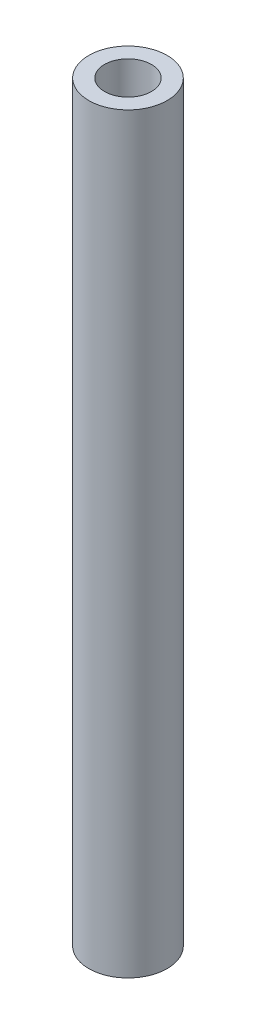
ISO-10303-21;
HEADER;
FILE_DESCRIPTION(('STEP AP214'),'2;1');
FILE_NAME('part.step','',(''),(''),'','','');
FILE_SCHEMA(('AUTOMOTIVE_DESIGN { 1 0 10303 214 1 1 1 1 }'));
ENDSEC;
DATA;
#1=APPLICATION_CONTEXT('core data for automotive mechanical design processes');
#2=APPLICATION_PROTOCOL_DEFINITION('international standard','automotive_design',2000,#1);
#3=PRODUCT_CONTEXT('',#1,'mechanical');
#4=PRODUCT('Part','Part','',(#3));
#5=PRODUCT_RELATED_PRODUCT_CATEGORY('part','',(#4));
#6=PRODUCT_DEFINITION_FORMATION('','',#4);
#7=PRODUCT_DEFINITION_CONTEXT('part definition',#1,'design');
#8=PRODUCT_DEFINITION('design','',#6,#7);
#9=PRODUCT_DEFINITION_SHAPE('','',#8);
#10=(LENGTH_UNIT() NAMED_UNIT(*) SI_UNIT(.MILLI.,.METRE.));
#11=(NAMED_UNIT(*) PLANE_ANGLE_UNIT() SI_UNIT($,.RADIAN.));
#12=(NAMED_UNIT(*) SI_UNIT($,.STERADIAN.) SOLID_ANGLE_UNIT());
#13=UNCERTAINTY_MEASURE_WITH_UNIT(LENGTH_MEASURE(1.E-05),#10,'distance_accuracy_value','');
#14=(GEOMETRIC_REPRESENTATION_CONTEXT(3) GLOBAL_UNCERTAINTY_ASSIGNED_CONTEXT((#13)) GLOBAL_UNIT_ASSIGNED_CONTEXT((#10,
#11,#12)) REPRESENTATION_CONTEXT('',''));
#15=CARTESIAN_POINT('',(0.,0.,0.));
#16=DIRECTION('',(0.,0.,1.));
#17=DIRECTION('',(1.,0.,0.));
#18=AXIS2_PLACEMENT_3D('',#15,#16,#17);
#19=CARTESIAN_POINT('',(0.,48.,0.));
#20=DIRECTION('',(0.,1.,0.));
#21=DIRECTION('',(0.,0.,1.));
#22=AXIS2_PLACEMENT_3D('',#19,#20,#21);
#23=PLANE('',#22);
#24=CARTESIAN_POINT('',(0.,48.,0.));
#25=DIRECTION('',(0.,1.,0.));
#26=DIRECTION('',(0.,0.,1.));
#27=AXIS2_PLACEMENT_3D('',#24,#25,#26);
#28=CIRCLE('',#27,2.5);
#29=CARTESIAN_POINT('',(0.,48.,2.5));
#30=VERTEX_POINT('',#29);
#31=EDGE_CURVE('E10',#30,#30,#28,.T.);
#32=ORIENTED_EDGE('',*,*,#31,.T.);
#33=EDGE_LOOP('',(#32));
#34=FACE_BOUND('',#33,.T.);
#35=CARTESIAN_POINT('',(0.,48.,0.));
#36=DIRECTION('',(0.,1.,0.));
#37=DIRECTION('',(0.,0.,1.));
#38=AXIS2_PLACEMENT_3D('',#35,#36,#37);
#39=CIRCLE('',#38,1.5);
#40=CARTESIAN_POINT('',(0.,48.,1.5));
#41=VERTEX_POINT('',#40);
#42=EDGE_CURVE('E44',#41,#41,#39,.T.);
#43=ORIENTED_EDGE('',*,*,#42,.F.);
#44=EDGE_LOOP('',(#43));
#45=FACE_BOUND('',#44,.T.);
#46=ADVANCED_FACE('F33',(#34,#45),#23,.T.);
#47=CARTESIAN_POINT('',(0.,0.,0.));
#48=DIRECTION('',(0.,1.,0.));
#49=DIRECTION('',(0.,0.,1.));
#50=AXIS2_PLACEMENT_3D('',#47,#48,#49);
#51=PLANE('',#50);
#52=CARTESIAN_POINT('',(0.,0.,0.));
#53=DIRECTION('',(0.,1.,0.));
#54=DIRECTION('',(0.,0.,1.));
#55=AXIS2_PLACEMENT_3D('',#52,#53,#54);
#56=CIRCLE('',#55,2.5);
#57=CARTESIAN_POINT('',(0.,0.,2.5));
#58=VERTEX_POINT('',#57);
#59=EDGE_CURVE('E37',#58,#58,#56,.T.);
#60=ORIENTED_EDGE('',*,*,#59,.F.);
#61=EDGE_LOOP('',(#60));
#62=FACE_BOUND('',#61,.T.);
#63=CARTESIAN_POINT('',(0.,0.,0.));
#64=DIRECTION('',(0.,1.,0.));
#65=DIRECTION('',(0.,0.,1.));
#66=AXIS2_PLACEMENT_3D('',#63,#64,#65);
#67=CIRCLE('',#66,1.5);
#68=CARTESIAN_POINT('',(0.,0.,1.5));
#69=VERTEX_POINT('',#68);
#70=EDGE_CURVE('E46',#69,#69,#67,.T.);
#71=ORIENTED_EDGE('',*,*,#70,.T.);
#72=EDGE_LOOP('',(#71));
#73=FACE_BOUND('',#72,.T.);
#74=ADVANCED_FACE('F56',(#62,#73),#51,.F.);
#75=CARTESIAN_POINT('',(0.,48.,0.));
#76=DIRECTION('',(0.,-1.,0.));
#77=DIRECTION('',(0.,0.,-1.));
#78=AXIS2_PLACEMENT_3D('',#75,#76,#77);
#79=CYLINDRICAL_SURFACE('',#78,2.5);
#80=ORIENTED_EDGE('',*,*,#31,.F.);
#81=EDGE_LOOP('',(#80));
#82=FACE_BOUND('',#81,.T.);
#83=ORIENTED_EDGE('',*,*,#59,.T.);
#84=EDGE_LOOP('',(#83));
#85=FACE_BOUND('',#84,.T.);
#86=ADVANCED_FACE('F35',(#82,#85),#79,.T.);
#87=CARTESIAN_POINT('',(0.,48.,0.));
#88=DIRECTION('',(0.,-1.,0.));
#89=DIRECTION('',(0.,0.,-1.));
#90=AXIS2_PLACEMENT_3D('',#87,#88,#89);
#91=CYLINDRICAL_SURFACE('',#90,1.5);
#92=ORIENTED_EDGE('',*,*,#42,.T.);
#93=EDGE_LOOP('',(#92));
#94=FACE_BOUND('',#93,.T.);
#95=ORIENTED_EDGE('',*,*,#70,.F.);
#96=EDGE_LOOP('',(#95));
#97=FACE_BOUND('',#96,.T.);
#98=ADVANCED_FACE('F52',(#94,#97),#91,.F.);
#99=CLOSED_SHELL('',(#46,#74,#86,#98));
#100=MANIFOLD_SOLID_BREP('B2',#99);
#101=ADVANCED_BREP_SHAPE_REPRESENTATION('',(#18,#100),#14);
#102=SHAPE_DEFINITION_REPRESENTATION(#9,#101);
ENDSEC;
END-ISO-10303-21;
